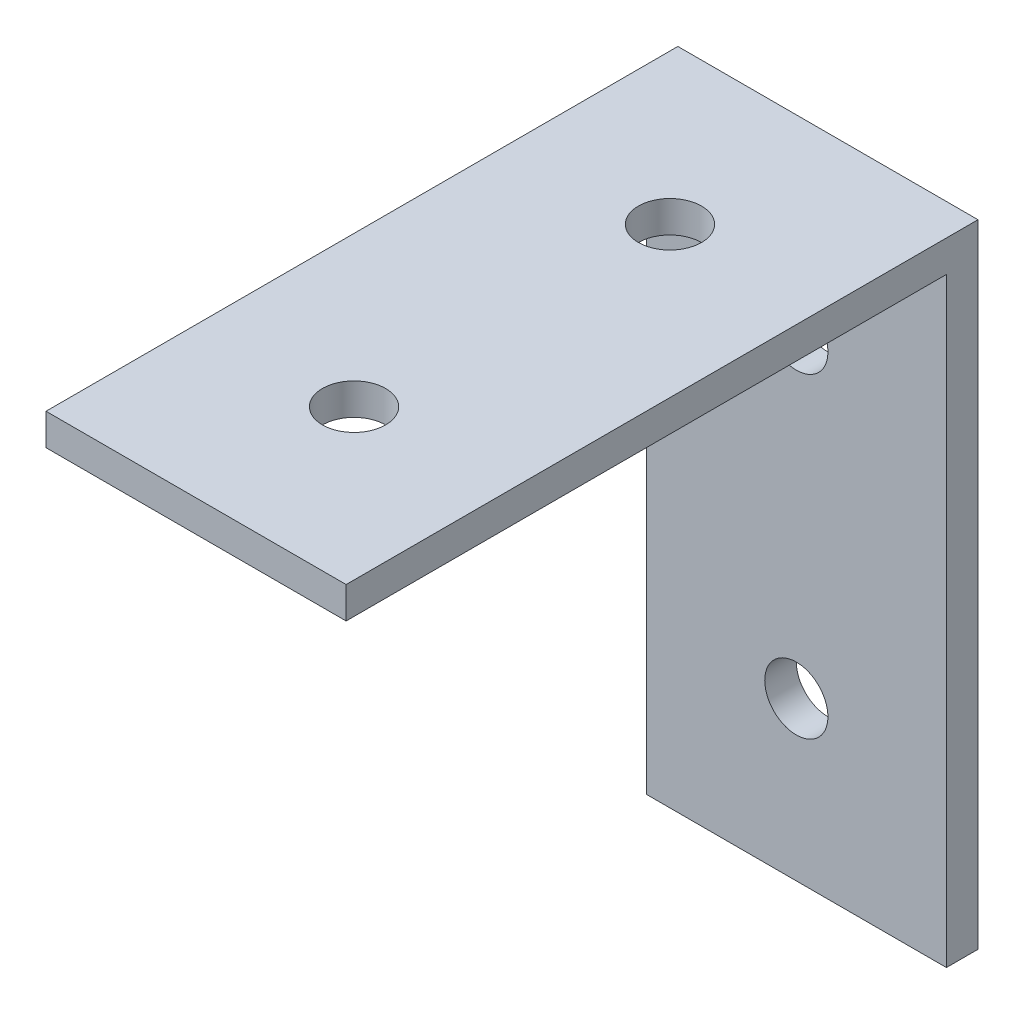
ISO-10303-21;
HEADER;
FILE_DESCRIPTION(('STEP AP214'),'2;1');
FILE_NAME('part.step','',(''),(''),'','','');
FILE_SCHEMA(('AUTOMOTIVE_DESIGN { 1 0 10303 214 1 1 1 1 }'));
ENDSEC;
DATA;
#1=APPLICATION_CONTEXT('core data for automotive mechanical design processes');
#2=APPLICATION_PROTOCOL_DEFINITION('international standard','automotive_design',2000,#1);
#3=PRODUCT_CONTEXT('',#1,'mechanical');
#4=PRODUCT('Part','Part','',(#3));
#5=PRODUCT_RELATED_PRODUCT_CATEGORY('part','',(#4));
#6=PRODUCT_DEFINITION_FORMATION('','',#4);
#7=PRODUCT_DEFINITION_CONTEXT('part definition',#1,'design');
#8=PRODUCT_DEFINITION('design','',#6,#7);
#9=PRODUCT_DEFINITION_SHAPE('','',#8);
#10=(LENGTH_UNIT() NAMED_UNIT(*) SI_UNIT(.MILLI.,.METRE.));
#11=(NAMED_UNIT(*) PLANE_ANGLE_UNIT() SI_UNIT($,.RADIAN.));
#12=(NAMED_UNIT(*) SI_UNIT($,.STERADIAN.) SOLID_ANGLE_UNIT());
#13=UNCERTAINTY_MEASURE_WITH_UNIT(LENGTH_MEASURE(1.E-05),#10,'distance_accuracy_value','');
#14=(GEOMETRIC_REPRESENTATION_CONTEXT(3) GLOBAL_UNCERTAINTY_ASSIGNED_CONTEXT((#13)) GLOBAL_UNIT_ASSIGNED_CONTEXT((#10,
#11,#12)) REPRESENTATION_CONTEXT('',''));
#15=CARTESIAN_POINT('',(0.,0.,0.));
#16=DIRECTION('',(0.,0.,1.));
#17=DIRECTION('',(1.,0.,0.));
#18=AXIS2_PLACEMENT_3D('',#15,#16,#17);
#19=CARTESIAN_POINT('',(0.,0.,2.));
#20=DIRECTION('',(0.,0.,-1.));
#21=DIRECTION('',(-1.,0.,0.));
#22=AXIS2_PLACEMENT_3D('',#19,#20,#21);
#23=PLANE('',#22);
#24=CARTESIAN_POINT('',(0.,10.,2.));
#25=DIRECTION('',(0.,0.,-1.));
#26=DIRECTION('',(-1.,0.,0.));
#27=AXIS2_PLACEMENT_3D('',#24,#25,#26);
#28=CIRCLE('',#27,2.);
#29=CARTESIAN_POINT('',(-2.,10.,2.));
#30=VERTEX_POINT('',#29);
#31=EDGE_CURVE('E152',#30,#30,#28,.T.);
#32=ORIENTED_EDGE('',*,*,#31,.T.);
#33=EDGE_LOOP('',(#32));
#34=FACE_BOUND('',#33,.T.);
#35=CARTESIAN_POINT('',(0.,-9.99999999999998,2.));
#36=DIRECTION('',(0.,0.,-1.));
#37=DIRECTION('',(-1.,0.,0.));
#38=AXIS2_PLACEMENT_3D('',#35,#36,#37);
#39=CIRCLE('',#38,2.);
#40=CARTESIAN_POINT('',(-2.,-9.99999999999998,2.));
#41=VERTEX_POINT('',#40);
#42=EDGE_CURVE('E145',#41,#41,#39,.T.);
#43=ORIENTED_EDGE('',*,*,#42,.T.);
#44=EDGE_LOOP('',(#43));
#45=FACE_BOUND('',#44,.T.);
#46=DIRECTION('',(1.,0.,0.));
#47=VECTOR('',#46,1.);
#48=CARTESIAN_POINT('',(-9.5,18.,2.));
#49=LINE('',#48,#47);
#50=CARTESIAN_POINT('',(-9.5,18.,2.));
#51=VERTEX_POINT('',#50);
#52=CARTESIAN_POINT('',(9.5,18.,2.));
#53=VERTEX_POINT('',#52);
#54=EDGE_CURVE('E56',#51,#53,#49,.T.);
#55=ORIENTED_EDGE('',*,*,#54,.F.);
#56=DIRECTION('',(0.,-1.,0.));
#57=VECTOR('',#56,1.);
#58=CARTESIAN_POINT('',(-9.5,-20.,2.));
#59=LINE('',#58,#57);
#60=CARTESIAN_POINT('',(-9.5,-20.,2.));
#61=VERTEX_POINT('',#60);
#62=EDGE_CURVE('E177',#51,#61,#59,.T.);
#63=ORIENTED_EDGE('',*,*,#62,.T.);
#64=DIRECTION('',(1.,0.,0.));
#65=VECTOR('',#64,1.);
#66=CARTESIAN_POINT('',(-9.5,-20.,2.));
#67=LINE('',#66,#65);
#68=CARTESIAN_POINT('',(9.5,-20.,2.));
#69=VERTEX_POINT('',#68);
#70=EDGE_CURVE('E62',#61,#69,#67,.T.);
#71=ORIENTED_EDGE('',*,*,#70,.T.);
#72=DIRECTION('',(0.,1.,0.));
#73=VECTOR('',#72,1.);
#74=CARTESIAN_POINT('',(9.5,-20.,2.));
#75=LINE('',#74,#73);
#76=EDGE_CURVE('E92',#69,#53,#75,.T.);
#77=ORIENTED_EDGE('',*,*,#76,.T.);
#78=EDGE_LOOP('',(#55,#63,#71,#77));
#79=FACE_BOUND('',#78,.T.);
#80=ADVANCED_FACE('F38',(#34,#45,#79),#23,.F.);
#81=CARTESIAN_POINT('',(9.5,-20.,2.));
#82=DIRECTION('',(-1.,0.,0.));
#83=DIRECTION('',(0.,0.,1.));
#84=AXIS2_PLACEMENT_3D('',#81,#82,#83);
#85=PLANE('',#84);
#86=DIRECTION('',(0.,1.,0.));
#87=VECTOR('',#86,1.);
#88=CARTESIAN_POINT('',(9.5,-20.,0.));
#89=LINE('',#88,#87);
#90=CARTESIAN_POINT('',(9.5,-20.,0.));
#91=VERTEX_POINT('',#90);
#92=CARTESIAN_POINT('',(9.5,20.,0.));
#93=VERTEX_POINT('',#92);
#94=EDGE_CURVE('E98',#91,#93,#89,.T.);
#95=ORIENTED_EDGE('',*,*,#94,.T.);
#96=DIRECTION('',(0.,0.,-1.));
#97=VECTOR('',#96,1.);
#98=CARTESIAN_POINT('',(9.5,20.,2.));
#99=LINE('',#98,#97);
#100=CARTESIAN_POINT('',(9.5,20.,40.));
#101=VERTEX_POINT('',#100);
#102=EDGE_CURVE('E11',#101,#93,#99,.T.);
#103=ORIENTED_EDGE('',*,*,#102,.F.);
#104=DIRECTION('',(0.,1.,0.));
#105=VECTOR('',#104,1.);
#106=CARTESIAN_POINT('',(9.5,20.,40.));
#107=LINE('',#106,#105);
#108=CARTESIAN_POINT('',(9.5,18.,40.));
#109=VERTEX_POINT('',#108);
#110=EDGE_CURVE('E164',#109,#101,#107,.T.);
#111=ORIENTED_EDGE('',*,*,#110,.F.);
#112=DIRECTION('',(0.,0.,-1.));
#113=VECTOR('',#112,1.);
#114=CARTESIAN_POINT('',(9.5,18.,40.));
#115=LINE('',#114,#113);
#116=EDGE_CURVE('E111',#109,#53,#115,.T.);
#117=ORIENTED_EDGE('',*,*,#116,.T.);
#118=ORIENTED_EDGE('',*,*,#76,.F.);
#119=DIRECTION('',(0.,0.,-1.));
#120=VECTOR('',#119,1.);
#121=CARTESIAN_POINT('',(9.5,-20.,2.));
#122=LINE('',#121,#120);
#123=EDGE_CURVE('E84',#69,#91,#122,.T.);
#124=ORIENTED_EDGE('',*,*,#123,.T.);
#125=EDGE_LOOP('',(#95,#103,#111,#117,#118,#124));
#126=FACE_BOUND('',#125,.T.);
#127=ADVANCED_FACE('F40',(#126),#85,.F.);
#128=CARTESIAN_POINT('',(-9.5,20.,2.));
#129=DIRECTION('',(0.,-1.,0.));
#130=DIRECTION('',(0.,0.,-1.));
#131=AXIS2_PLACEMENT_3D('',#128,#129,#130);
#132=PLANE('',#131);
#133=CARTESIAN_POINT('',(0.,20.,10.));
#134=DIRECTION('',(0.,1.,0.));
#135=DIRECTION('',(0.,0.,1.));
#136=AXIS2_PLACEMENT_3D('',#133,#134,#135);
#137=CIRCLE('',#136,2.);
#138=CARTESIAN_POINT('',(0.,20.,12.));
#139=VERTEX_POINT('',#138);
#140=EDGE_CURVE('E125',#139,#139,#137,.T.);
#141=ORIENTED_EDGE('',*,*,#140,.F.);
#142=EDGE_LOOP('',(#141));
#143=FACE_BOUND('',#142,.T.);
#144=CARTESIAN_POINT('',(0.,20.,30.));
#145=DIRECTION('',(0.,1.,0.));
#146=DIRECTION('',(0.,0.,1.));
#147=AXIS2_PLACEMENT_3D('',#144,#145,#146);
#148=CIRCLE('',#147,2.);
#149=CARTESIAN_POINT('',(0.,20.,32.));
#150=VERTEX_POINT('',#149);
#151=EDGE_CURVE('E133',#150,#150,#148,.T.);
#152=ORIENTED_EDGE('',*,*,#151,.F.);
#153=EDGE_LOOP('',(#152));
#154=FACE_BOUND('',#153,.T.);
#155=DIRECTION('',(-1.,0.,0.));
#156=VECTOR('',#155,1.);
#157=CARTESIAN_POINT('',(-9.5,20.,0.));
#158=LINE('',#157,#156);
#159=CARTESIAN_POINT('',(-9.5,20.,0.));
#160=VERTEX_POINT('',#159);
#161=EDGE_CURVE('E103',#93,#160,#158,.T.);
#162=ORIENTED_EDGE('',*,*,#161,.T.);
#163=DIRECTION('',(0.,0.,-1.));
#164=VECTOR('',#163,1.);
#165=CARTESIAN_POINT('',(-9.5,20.,2.));
#166=LINE('',#165,#164);
#167=CARTESIAN_POINT('',(-9.5,20.,40.));
#168=VERTEX_POINT('',#167);
#169=EDGE_CURVE('E48',#168,#160,#166,.T.);
#170=ORIENTED_EDGE('',*,*,#169,.F.);
#171=DIRECTION('',(-1.,0.,0.));
#172=VECTOR('',#171,1.);
#173=CARTESIAN_POINT('',(-9.5,20.,40.));
#174=LINE('',#173,#172);
#175=EDGE_CURVE('E168',#101,#168,#174,.T.);
#176=ORIENTED_EDGE('',*,*,#175,.F.);
#177=ORIENTED_EDGE('',*,*,#102,.T.);
#178=EDGE_LOOP('',(#162,#170,#176,#177));
#179=FACE_BOUND('',#178,.T.);
#180=ADVANCED_FACE('F187',(#143,#154,#179),#132,.F.);
#181=CARTESIAN_POINT('',(-9.5,-20.,2.));
#182=DIRECTION('',(1.,0.,0.));
#183=DIRECTION('',(0.,0.,-1.));
#184=AXIS2_PLACEMENT_3D('',#181,#182,#183);
#185=PLANE('',#184);
#186=DIRECTION('',(0.,-1.,0.));
#187=VECTOR('',#186,1.);
#188=CARTESIAN_POINT('',(-9.5,-20.,0.));
#189=LINE('',#188,#187);
#190=CARTESIAN_POINT('',(-9.5,-20.,0.));
#191=VERTEX_POINT('',#190);
#192=EDGE_CURVE('E93',#160,#191,#189,.T.);
#193=ORIENTED_EDGE('',*,*,#192,.T.);
#194=DIRECTION('',(0.,0.,-1.));
#195=VECTOR('',#194,1.);
#196=CARTESIAN_POINT('',(-9.5,-20.,2.));
#197=LINE('',#196,#195);
#198=EDGE_CURVE('E87',#61,#191,#197,.T.);
#199=ORIENTED_EDGE('',*,*,#198,.F.);
#200=ORIENTED_EDGE('',*,*,#62,.F.);
#201=DIRECTION('',(0.,0.,-1.));
#202=VECTOR('',#201,1.);
#203=CARTESIAN_POINT('',(-9.5,18.,40.));
#204=LINE('',#203,#202);
#205=CARTESIAN_POINT('',(-9.5,18.,40.));
#206=VERTEX_POINT('',#205);
#207=EDGE_CURVE('E105',#206,#51,#204,.T.);
#208=ORIENTED_EDGE('',*,*,#207,.F.);
#209=DIRECTION('',(0.,-1.,0.));
#210=VECTOR('',#209,1.);
#211=CARTESIAN_POINT('',(-9.5,20.,40.));
#212=LINE('',#211,#210);
#213=EDGE_CURVE('E156',#168,#206,#212,.T.);
#214=ORIENTED_EDGE('',*,*,#213,.F.);
#215=ORIENTED_EDGE('',*,*,#169,.T.);
#216=EDGE_LOOP('',(#193,#199,#200,#208,#214,#215));
#217=FACE_BOUND('',#216,.T.);
#218=ADVANCED_FACE('F182',(#217),#185,.F.);
#219=CARTESIAN_POINT('',(-9.5,-20.,2.));
#220=DIRECTION('',(0.,1.,0.));
#221=DIRECTION('',(0.,0.,1.));
#222=AXIS2_PLACEMENT_3D('',#219,#220,#221);
#223=PLANE('',#222);
#224=DIRECTION('',(1.,0.,0.));
#225=VECTOR('',#224,1.);
#226=CARTESIAN_POINT('',(-9.5,-20.,0.));
#227=LINE('',#226,#225);
#228=EDGE_CURVE('E81',#191,#91,#227,.T.);
#229=ORIENTED_EDGE('',*,*,#228,.T.);
#230=ORIENTED_EDGE('',*,*,#123,.F.);
#231=ORIENTED_EDGE('',*,*,#70,.F.);
#232=ORIENTED_EDGE('',*,*,#198,.T.);
#233=EDGE_LOOP('',(#229,#230,#231,#232));
#234=FACE_BOUND('',#233,.T.);
#235=ADVANCED_FACE('F83',(#234),#223,.F.);
#236=CARTESIAN_POINT('',(0.,0.,0.));
#237=DIRECTION('',(0.,0.,-1.));
#238=DIRECTION('',(-1.,0.,0.));
#239=AXIS2_PLACEMENT_3D('',#236,#237,#238);
#240=PLANE('',#239);
#241=CARTESIAN_POINT('',(0.,10.,0.));
#242=DIRECTION('',(0.,0.,-1.));
#243=DIRECTION('',(-1.,0.,0.));
#244=AXIS2_PLACEMENT_3D('',#241,#242,#243);
#245=CIRCLE('',#244,2.);
#246=CARTESIAN_POINT('',(-2.,10.,0.));
#247=VERTEX_POINT('',#246);
#248=EDGE_CURVE('E141',#247,#247,#245,.T.);
#249=ORIENTED_EDGE('',*,*,#248,.F.);
#250=EDGE_LOOP('',(#249));
#251=FACE_BOUND('',#250,.T.);
#252=CARTESIAN_POINT('',(0.,-9.99999999999998,0.));
#253=DIRECTION('',(0.,0.,-1.));
#254=DIRECTION('',(-1.,0.,0.));
#255=AXIS2_PLACEMENT_3D('',#252,#253,#254);
#256=CIRCLE('',#255,2.);
#257=CARTESIAN_POINT('',(-2.,-9.99999999999998,0.));
#258=VERTEX_POINT('',#257);
#259=EDGE_CURVE('E131',#258,#258,#256,.T.);
#260=ORIENTED_EDGE('',*,*,#259,.F.);
#261=EDGE_LOOP('',(#260));
#262=FACE_BOUND('',#261,.T.);
#263=ORIENTED_EDGE('',*,*,#94,.F.);
#264=ORIENTED_EDGE('',*,*,#228,.F.);
#265=ORIENTED_EDGE('',*,*,#192,.F.);
#266=ORIENTED_EDGE('',*,*,#161,.F.);
#267=EDGE_LOOP('',(#263,#264,#265,#266));
#268=FACE_BOUND('',#267,.T.);
#269=ADVANCED_FACE('F102',(#251,#262,#268),#240,.T.);
#270=CARTESIAN_POINT('',(-9.5,18.,40.));
#271=DIRECTION('',(0.,1.,0.));
#272=DIRECTION('',(0.,0.,1.));
#273=AXIS2_PLACEMENT_3D('',#270,#271,#272);
#274=PLANE('',#273);
#275=CARTESIAN_POINT('',(0.,18.,10.));
#276=DIRECTION('',(0.,1.,0.));
#277=DIRECTION('',(0.,0.,1.));
#278=AXIS2_PLACEMENT_3D('',#275,#276,#277);
#279=CIRCLE('',#278,2.);
#280=CARTESIAN_POINT('',(0.,18.,12.));
#281=VERTEX_POINT('',#280);
#282=EDGE_CURVE('E42',#281,#281,#279,.T.);
#283=ORIENTED_EDGE('',*,*,#282,.T.);
#284=EDGE_LOOP('',(#283));
#285=FACE_BOUND('',#284,.T.);
#286=CARTESIAN_POINT('',(0.,18.,30.));
#287=DIRECTION('',(0.,1.,0.));
#288=DIRECTION('',(0.,0.,1.));
#289=AXIS2_PLACEMENT_3D('',#286,#287,#288);
#290=CIRCLE('',#289,2.);
#291=CARTESIAN_POINT('',(0.,18.,32.));
#292=VERTEX_POINT('',#291);
#293=EDGE_CURVE('E122',#292,#292,#290,.T.);
#294=ORIENTED_EDGE('',*,*,#293,.T.);
#295=EDGE_LOOP('',(#294));
#296=FACE_BOUND('',#295,.T.);
#297=ORIENTED_EDGE('',*,*,#54,.T.);
#298=ORIENTED_EDGE('',*,*,#116,.F.);
#299=DIRECTION('',(1.,0.,0.));
#300=VECTOR('',#299,1.);
#301=CARTESIAN_POINT('',(-9.5,18.,40.));
#302=LINE('',#301,#300);
#303=EDGE_CURVE('E160',#206,#109,#302,.T.);
#304=ORIENTED_EDGE('',*,*,#303,.F.);
#305=ORIENTED_EDGE('',*,*,#207,.T.);
#306=EDGE_LOOP('',(#297,#298,#304,#305));
#307=FACE_BOUND('',#306,.T.);
#308=ADVANCED_FACE('F202',(#285,#296,#307),#274,.F.);
#309=CARTESIAN_POINT('',(0.,0.,40.));
#310=DIRECTION('',(0.,0.,1.));
#311=DIRECTION('',(1.,0.,0.));
#312=AXIS2_PLACEMENT_3D('',#309,#310,#311);
#313=PLANE('',#312);
#314=ORIENTED_EDGE('',*,*,#213,.T.);
#315=ORIENTED_EDGE('',*,*,#303,.T.);
#316=ORIENTED_EDGE('',*,*,#110,.T.);
#317=ORIENTED_EDGE('',*,*,#175,.T.);
#318=EDGE_LOOP('',(#314,#315,#316,#317));
#319=FACE_BOUND('',#318,.T.);
#320=ADVANCED_FACE('F191',(#319),#313,.T.);
#321=CARTESIAN_POINT('',(0.,-9.99999999999998,10.));
#322=DIRECTION('',(0.,0.,-1.));
#323=DIRECTION('',(-1.,0.,0.));
#324=AXIS2_PLACEMENT_3D('',#321,#322,#323);
#325=CYLINDRICAL_SURFACE('',#324,2.);
#326=ORIENTED_EDGE('',*,*,#259,.T.);
#327=EDGE_LOOP('',(#326));
#328=FACE_BOUND('',#327,.T.);
#329=ORIENTED_EDGE('',*,*,#42,.F.);
#330=EDGE_LOOP('',(#329));
#331=FACE_BOUND('',#330,.T.);
#332=ADVANCED_FACE('F211',(#328,#331),#325,.F.);
#333=CARTESIAN_POINT('',(0.,10.,10.));
#334=DIRECTION('',(0.,0.,-1.));
#335=DIRECTION('',(-1.,0.,0.));
#336=AXIS2_PLACEMENT_3D('',#333,#334,#335);
#337=CYLINDRICAL_SURFACE('',#336,2.);
#338=ORIENTED_EDGE('',*,*,#248,.T.);
#339=EDGE_LOOP('',(#338));
#340=FACE_BOUND('',#339,.T.);
#341=ORIENTED_EDGE('',*,*,#31,.F.);
#342=EDGE_LOOP('',(#341));
#343=FACE_BOUND('',#342,.T.);
#344=ADVANCED_FACE('F239',(#340,#343),#337,.F.);
#345=CARTESIAN_POINT('',(0.,10.,30.));
#346=DIRECTION('',(0.,1.,0.));
#347=DIRECTION('',(0.,0.,1.));
#348=AXIS2_PLACEMENT_3D('',#345,#346,#347);
#349=CYLINDRICAL_SURFACE('',#348,2.);
#350=ORIENTED_EDGE('',*,*,#151,.T.);
#351=EDGE_LOOP('',(#350));
#352=FACE_BOUND('',#351,.T.);
#353=ORIENTED_EDGE('',*,*,#293,.F.);
#354=EDGE_LOOP('',(#353));
#355=FACE_BOUND('',#354,.T.);
#356=ADVANCED_FACE('F235',(#352,#355),#349,.F.);
#357=CARTESIAN_POINT('',(0.,10.,10.));
#358=DIRECTION('',(0.,1.,0.));
#359=DIRECTION('',(0.,0.,1.));
#360=AXIS2_PLACEMENT_3D('',#357,#358,#359);
#361=CYLINDRICAL_SURFACE('',#360,2.);
#362=ORIENTED_EDGE('',*,*,#140,.T.);
#363=EDGE_LOOP('',(#362));
#364=FACE_BOUND('',#363,.T.);
#365=ORIENTED_EDGE('',*,*,#282,.F.);
#366=EDGE_LOOP('',(#365));
#367=FACE_BOUND('',#366,.T.);
#368=ADVANCED_FACE('F238',(#364,#367),#361,.F.);
#369=CLOSED_SHELL('',(#80,#127,#180,#218,#235,#269,#308,#320,#332,#344,#356,#368));
#370=MANIFOLD_SOLID_BREP('B2',#369);
#371=ADVANCED_BREP_SHAPE_REPRESENTATION('',(#18,#370),#14);
#372=SHAPE_DEFINITION_REPRESENTATION(#9,#371);
ENDSEC;
END-ISO-10303-21;
